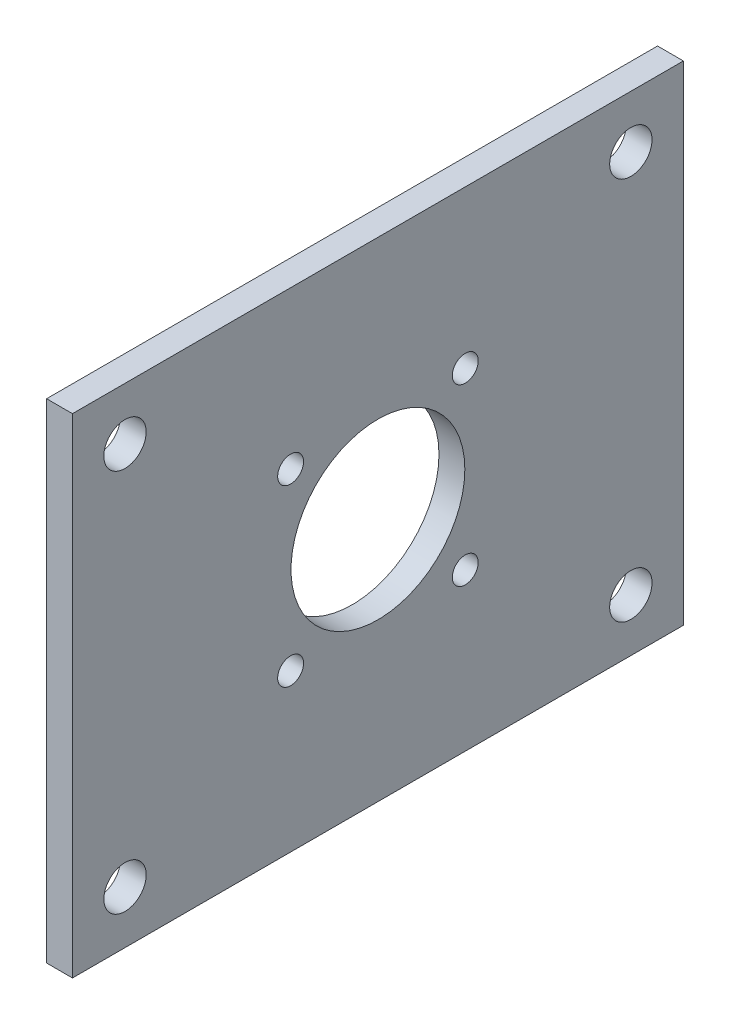
ISO-10303-21;
HEADER;
FILE_DESCRIPTION(('STEP AP214'),'2;1');
FILE_NAME('part.step','',(''),(''),'','','');
FILE_SCHEMA(('AUTOMOTIVE_DESIGN { 1 0 10303 214 1 1 1 1 }'));
ENDSEC;
DATA;
#1=APPLICATION_CONTEXT('core data for automotive mechanical design processes');
#2=APPLICATION_PROTOCOL_DEFINITION('international standard','automotive_design',2000,#1);
#3=PRODUCT_CONTEXT('',#1,'mechanical');
#4=PRODUCT('Part','Part','',(#3));
#5=PRODUCT_RELATED_PRODUCT_CATEGORY('part','',(#4));
#6=PRODUCT_DEFINITION_FORMATION('','',#4);
#7=PRODUCT_DEFINITION_CONTEXT('part definition',#1,'design');
#8=PRODUCT_DEFINITION('design','',#6,#7);
#9=PRODUCT_DEFINITION_SHAPE('','',#8);
#10=(LENGTH_UNIT() NAMED_UNIT(*) SI_UNIT(.MILLI.,.METRE.));
#11=(NAMED_UNIT(*) PLANE_ANGLE_UNIT() SI_UNIT($,.RADIAN.));
#12=(NAMED_UNIT(*) SI_UNIT($,.STERADIAN.) SOLID_ANGLE_UNIT());
#13=UNCERTAINTY_MEASURE_WITH_UNIT(LENGTH_MEASURE(1.E-05),#10,'distance_accuracy_value','');
#14=(GEOMETRIC_REPRESENTATION_CONTEXT(3) GLOBAL_UNCERTAINTY_ASSIGNED_CONTEXT((#13)) GLOBAL_UNIT_ASSIGNED_CONTEXT((#10,
#11,#12)) REPRESENTATION_CONTEXT('',''));
#15=CARTESIAN_POINT('',(0.,0.,0.));
#16=DIRECTION('',(0.,0.,1.));
#17=DIRECTION('',(1.,0.,0.));
#18=AXIS2_PLACEMENT_3D('',#15,#16,#17);
#19=CARTESIAN_POINT('',(-1.5875,-30.,-37.5));
#20=DIRECTION('',(0.,0.,-1.));
#21=DIRECTION('',(-1.,0.,0.));
#22=AXIS2_PLACEMENT_3D('',#19,#20,#21);
#23=PLANE('',#22);
#24=DIRECTION('',(1.,0.,0.));
#25=VECTOR('',#24,1.);
#26=CARTESIAN_POINT('',(-1.5875,30.,-37.5));
#27=LINE('',#26,#25);
#28=CARTESIAN_POINT('',(-1.5875,30.,-37.5));
#29=VERTEX_POINT('',#28);
#30=CARTESIAN_POINT('',(1.5875,30.,-37.5));
#31=VERTEX_POINT('',#30);
#32=EDGE_CURVE('E38',#29,#31,#27,.T.);
#33=ORIENTED_EDGE('',*,*,#32,.T.);
#34=DIRECTION('',(0.,1.,0.));
#35=VECTOR('',#34,1.);
#36=CARTESIAN_POINT('',(1.5875,-30.,-37.5));
#37=LINE('',#36,#35);
#38=CARTESIAN_POINT('',(1.5875,-30.,-37.5));
#39=VERTEX_POINT('',#38);
#40=EDGE_CURVE('E75',#39,#31,#37,.T.);
#41=ORIENTED_EDGE('',*,*,#40,.F.);
#42=DIRECTION('',(1.,0.,0.));
#43=VECTOR('',#42,1.);
#44=CARTESIAN_POINT('',(-1.5875,-30.,-37.5));
#45=LINE('',#44,#43);
#46=CARTESIAN_POINT('',(-1.5875,-30.,-37.5));
#47=VERTEX_POINT('',#46);
#48=EDGE_CURVE('E11',#47,#39,#45,.T.);
#49=ORIENTED_EDGE('',*,*,#48,.F.);
#50=DIRECTION('',(0.,1.,0.));
#51=VECTOR('',#50,1.);
#52=CARTESIAN_POINT('',(-1.5875,-30.,-37.5));
#53=LINE('',#52,#51);
#54=EDGE_CURVE('E76',#47,#29,#53,.T.);
#55=ORIENTED_EDGE('',*,*,#54,.T.);
#56=EDGE_LOOP('',(#33,#41,#49,#55));
#57=FACE_BOUND('',#56,.T.);
#58=ADVANCED_FACE('F35',(#57),#23,.T.);
#59=CARTESIAN_POINT('',(-1.5875,-30.,37.5));
#60=DIRECTION('',(0.,-1.,0.));
#61=DIRECTION('',(0.,0.,-1.));
#62=AXIS2_PLACEMENT_3D('',#59,#60,#61);
#63=PLANE('',#62);
#64=ORIENTED_EDGE('',*,*,#48,.T.);
#65=DIRECTION('',(0.,0.,-1.));
#66=VECTOR('',#65,1.);
#67=CARTESIAN_POINT('',(1.5875,-30.,37.5));
#68=LINE('',#67,#66);
#69=CARTESIAN_POINT('',(1.5875,-30.,37.5));
#70=VERTEX_POINT('',#69);
#71=EDGE_CURVE('E92',#70,#39,#68,.T.);
#72=ORIENTED_EDGE('',*,*,#71,.F.);
#73=DIRECTION('',(1.,0.,0.));
#74=VECTOR('',#73,1.);
#75=CARTESIAN_POINT('',(-1.5875,-30.,37.5));
#76=LINE('',#75,#74);
#77=CARTESIAN_POINT('',(-1.5875,-30.,37.5));
#78=VERTEX_POINT('',#77);
#79=EDGE_CURVE('E43',#78,#70,#76,.T.);
#80=ORIENTED_EDGE('',*,*,#79,.F.);
#81=DIRECTION('',(0.,0.,-1.));
#82=VECTOR('',#81,1.);
#83=CARTESIAN_POINT('',(-1.5875,-30.,37.5));
#84=LINE('',#83,#82);
#85=EDGE_CURVE('E81',#78,#47,#84,.T.);
#86=ORIENTED_EDGE('',*,*,#85,.T.);
#87=EDGE_LOOP('',(#64,#72,#80,#86));
#88=FACE_BOUND('',#87,.T.);
#89=ADVANCED_FACE('F112',(#88),#63,.T.);
#90=CARTESIAN_POINT('',(-1.5875,-30.,37.5));
#91=DIRECTION('',(0.,0.,1.));
#92=DIRECTION('',(1.,0.,0.));
#93=AXIS2_PLACEMENT_3D('',#90,#91,#92);
#94=PLANE('',#93);
#95=ORIENTED_EDGE('',*,*,#79,.T.);
#96=DIRECTION('',(0.,-1.,0.));
#97=VECTOR('',#96,1.);
#98=CARTESIAN_POINT('',(1.5875,-30.,37.5));
#99=LINE('',#98,#97);
#100=CARTESIAN_POINT('',(1.5875,30.,37.5));
#101=VERTEX_POINT('',#100);
#102=EDGE_CURVE('E88',#101,#70,#99,.T.);
#103=ORIENTED_EDGE('',*,*,#102,.F.);
#104=DIRECTION('',(1.,0.,0.));
#105=VECTOR('',#104,1.);
#106=CARTESIAN_POINT('',(-1.5875,30.,37.5));
#107=LINE('',#106,#105);
#108=CARTESIAN_POINT('',(-1.5875,30.,37.5));
#109=VERTEX_POINT('',#108);
#110=EDGE_CURVE('E80',#109,#101,#107,.T.);
#111=ORIENTED_EDGE('',*,*,#110,.F.);
#112=DIRECTION('',(0.,-1.,0.));
#113=VECTOR('',#112,1.);
#114=CARTESIAN_POINT('',(-1.5875,-30.,37.5));
#115=LINE('',#114,#113);
#116=EDGE_CURVE('E105',#109,#78,#115,.T.);
#117=ORIENTED_EDGE('',*,*,#116,.T.);
#118=EDGE_LOOP('',(#95,#103,#111,#117));
#119=FACE_BOUND('',#118,.T.);
#120=ADVANCED_FACE('F109',(#119),#94,.T.);
#121=CARTESIAN_POINT('',(-1.5875,30.,37.5));
#122=DIRECTION('',(0.,1.,0.));
#123=DIRECTION('',(0.,0.,1.));
#124=AXIS2_PLACEMENT_3D('',#121,#122,#123);
#125=PLANE('',#124);
#126=ORIENTED_EDGE('',*,*,#110,.T.);
#127=DIRECTION('',(0.,0.,1.));
#128=VECTOR('',#127,1.);
#129=CARTESIAN_POINT('',(1.5875,30.,37.5));
#130=LINE('',#129,#128);
#131=EDGE_CURVE('E83',#31,#101,#130,.T.);
#132=ORIENTED_EDGE('',*,*,#131,.F.);
#133=ORIENTED_EDGE('',*,*,#32,.F.);
#134=DIRECTION('',(0.,0.,1.));
#135=VECTOR('',#134,1.);
#136=CARTESIAN_POINT('',(-1.5875,30.,37.5));
#137=LINE('',#136,#135);
#138=EDGE_CURVE('E103',#29,#109,#137,.T.);
#139=ORIENTED_EDGE('',*,*,#138,.T.);
#140=EDGE_LOOP('',(#126,#132,#133,#139));
#141=FACE_BOUND('',#140,.T.);
#142=ADVANCED_FACE('F84',(#141),#125,.T.);
#143=CARTESIAN_POINT('',(-1.5875,0.,0.));
#144=DIRECTION('',(-1.,0.,0.));
#145=DIRECTION('',(0.,0.,1.));
#146=AXIS2_PLACEMENT_3D('',#143,#144,#145);
#147=PLANE('',#146);
#148=CARTESIAN_POINT('',(-1.5875,-10.72,10.72));
#149=DIRECTION('',(1.,0.,0.));
#150=DIRECTION('',(0.,0.,1.));
#151=AXIS2_PLACEMENT_3D('',#148,#149,#150);
#152=CIRCLE('',#151,1.59);
#153=CARTESIAN_POINT('',(-1.5875,-10.72,12.31));
#154=VERTEX_POINT('',#153);
#155=EDGE_CURVE('E245',#154,#154,#152,.T.);
#156=ORIENTED_EDGE('',*,*,#155,.T.);
#157=EDGE_LOOP('',(#156));
#158=FACE_BOUND('',#157,.T.);
#159=CARTESIAN_POINT('',(-1.5875,-10.72,-10.72));
#160=DIRECTION('',(1.,0.,0.));
#161=DIRECTION('',(0.,0.,-1.));
#162=AXIS2_PLACEMENT_3D('',#159,#160,#161);
#163=CIRCLE('',#162,1.59);
#164=CARTESIAN_POINT('',(-1.5875,-10.72,-12.31));
#165=VERTEX_POINT('',#164);
#166=EDGE_CURVE('E253',#165,#165,#163,.T.);
#167=ORIENTED_EDGE('',*,*,#166,.T.);
#168=EDGE_LOOP('',(#167));
#169=FACE_BOUND('',#168,.T.);
#170=CARTESIAN_POINT('',(-1.5875,10.72,-10.72));
#171=DIRECTION('',(1.,0.,0.));
#172=DIRECTION('',(0.,0.,1.));
#173=AXIS2_PLACEMENT_3D('',#170,#171,#172);
#174=CIRCLE('',#173,1.59);
#175=CARTESIAN_POINT('',(-1.5875,10.72,-9.13));
#176=VERTEX_POINT('',#175);
#177=EDGE_CURVE('E312',#176,#176,#174,.T.);
#178=ORIENTED_EDGE('',*,*,#177,.T.);
#179=EDGE_LOOP('',(#178));
#180=FACE_BOUND('',#179,.T.);
#181=CARTESIAN_POINT('',(-1.5875,10.72,10.72));
#182=DIRECTION('',(1.,0.,0.));
#183=DIRECTION('',(0.,0.,-1.));
#184=AXIS2_PLACEMENT_3D('',#181,#182,#183);
#185=CIRCLE('',#184,1.59);
#186=CARTESIAN_POINT('',(-1.5875,10.72,9.13));
#187=VERTEX_POINT('',#186);
#188=EDGE_CURVE('E260',#187,#187,#185,.T.);
#189=ORIENTED_EDGE('',*,*,#188,.T.);
#190=EDGE_LOOP('',(#189));
#191=FACE_BOUND('',#190,.T.);
#192=CARTESIAN_POINT('',(-1.5875,0.,0.));
#193=DIRECTION('',(1.,0.,0.));
#194=DIRECTION('',(0.,0.,-1.));
#195=AXIS2_PLACEMENT_3D('',#192,#193,#194);
#196=CIRCLE('',#195,10.67);
#197=CARTESIAN_POINT('',(-1.5875,0.,-10.67));
#198=VERTEX_POINT('',#197);
#199=EDGE_CURVE('E259',#198,#198,#196,.T.);
#200=ORIENTED_EDGE('',*,*,#199,.T.);
#201=EDGE_LOOP('',(#200));
#202=FACE_BOUND('',#201,.T.);
#203=CARTESIAN_POINT('',(-1.5875,-23.55,31.05));
#204=DIRECTION('',(1.,0.,0.));
#205=DIRECTION('',(0.,0.,1.));
#206=AXIS2_PLACEMENT_3D('',#203,#204,#205);
#207=CIRCLE('',#206,2.6);
#208=CARTESIAN_POINT('',(-1.5875,-23.55,33.65));
#209=VERTEX_POINT('',#208);
#210=EDGE_CURVE('E274',#209,#209,#207,.T.);
#211=ORIENTED_EDGE('',*,*,#210,.T.);
#212=EDGE_LOOP('',(#211));
#213=FACE_BOUND('',#212,.T.);
#214=CARTESIAN_POINT('',(-1.5875,-23.55,-31.05));
#215=DIRECTION('',(1.,0.,0.));
#216=DIRECTION('',(0.,0.,-1.));
#217=AXIS2_PLACEMENT_3D('',#214,#215,#216);
#218=CIRCLE('',#217,2.6);
#219=CARTESIAN_POINT('',(-1.5875,-23.55,-33.65));
#220=VERTEX_POINT('',#219);
#221=EDGE_CURVE('E268',#220,#220,#218,.T.);
#222=ORIENTED_EDGE('',*,*,#221,.T.);
#223=EDGE_LOOP('',(#222));
#224=FACE_BOUND('',#223,.T.);
#225=CARTESIAN_POINT('',(-1.5875,23.55,-31.05));
#226=DIRECTION('',(1.,0.,0.));
#227=DIRECTION('',(0.,0.,1.));
#228=AXIS2_PLACEMENT_3D('',#225,#226,#227);
#229=CIRCLE('',#228,2.6);
#230=CARTESIAN_POINT('',(-1.5875,23.55,-28.45));
#231=VERTEX_POINT('',#230);
#232=EDGE_CURVE('E267',#231,#231,#229,.T.);
#233=ORIENTED_EDGE('',*,*,#232,.T.);
#234=EDGE_LOOP('',(#233));
#235=FACE_BOUND('',#234,.T.);
#236=CARTESIAN_POINT('',(-1.5875,23.55,31.05));
#237=DIRECTION('',(1.,0.,0.));
#238=DIRECTION('',(0.,0.,-1.));
#239=AXIS2_PLACEMENT_3D('',#236,#237,#238);
#240=CIRCLE('',#239,2.6);
#241=CARTESIAN_POINT('',(-1.5875,23.55,28.45));
#242=VERTEX_POINT('',#241);
#243=EDGE_CURVE('E93',#242,#242,#240,.T.);
#244=ORIENTED_EDGE('',*,*,#243,.T.);
#245=EDGE_LOOP('',(#244));
#246=FACE_BOUND('',#245,.T.);
#247=ORIENTED_EDGE('',*,*,#54,.F.);
#248=ORIENTED_EDGE('',*,*,#85,.F.);
#249=ORIENTED_EDGE('',*,*,#116,.F.);
#250=ORIENTED_EDGE('',*,*,#138,.F.);
#251=EDGE_LOOP('',(#247,#248,#249,#250));
#252=FACE_BOUND('',#251,.T.);
#253=ADVANCED_FACE('F114',(#158,#169,#180,#191,#202,#213,#224,#235,#246,#252),#147,.T.);
#254=CARTESIAN_POINT('',(1.5875,0.,0.));
#255=DIRECTION('',(-1.,0.,0.));
#256=DIRECTION('',(0.,0.,1.));
#257=AXIS2_PLACEMENT_3D('',#254,#255,#256);
#258=PLANE('',#257);
#259=CARTESIAN_POINT('',(1.5875,-10.72,10.72));
#260=DIRECTION('',(1.,0.,0.));
#261=DIRECTION('',(0.,0.,1.));
#262=AXIS2_PLACEMENT_3D('',#259,#260,#261);
#263=CIRCLE('',#262,1.59);
#264=CARTESIAN_POINT('',(1.5875,-10.72,12.31));
#265=VERTEX_POINT('',#264);
#266=EDGE_CURVE('E248',#265,#265,#263,.T.);
#267=ORIENTED_EDGE('',*,*,#266,.F.);
#268=EDGE_LOOP('',(#267));
#269=FACE_BOUND('',#268,.T.);
#270=CARTESIAN_POINT('',(1.5875,-10.72,-10.72));
#271=DIRECTION('',(1.,0.,0.));
#272=DIRECTION('',(0.,0.,-1.));
#273=AXIS2_PLACEMENT_3D('',#270,#271,#272);
#274=CIRCLE('',#273,1.59);
#275=CARTESIAN_POINT('',(1.5875,-10.72,-12.31));
#276=VERTEX_POINT('',#275);
#277=EDGE_CURVE('E250',#276,#276,#274,.T.);
#278=ORIENTED_EDGE('',*,*,#277,.F.);
#279=EDGE_LOOP('',(#278));
#280=FACE_BOUND('',#279,.T.);
#281=CARTESIAN_POINT('',(1.5875,10.72,-10.72));
#282=DIRECTION('',(1.,0.,0.));
#283=DIRECTION('',(0.,0.,1.));
#284=AXIS2_PLACEMENT_3D('',#281,#282,#283);
#285=CIRCLE('',#284,1.59);
#286=CARTESIAN_POINT('',(1.5875,10.72,-9.13));
#287=VERTEX_POINT('',#286);
#288=EDGE_CURVE('E315',#287,#287,#285,.T.);
#289=ORIENTED_EDGE('',*,*,#288,.F.);
#290=EDGE_LOOP('',(#289));
#291=FACE_BOUND('',#290,.T.);
#292=CARTESIAN_POINT('',(1.5875,10.72,10.72));
#293=DIRECTION('',(1.,0.,0.));
#294=DIRECTION('',(0.,0.,-1.));
#295=AXIS2_PLACEMENT_3D('',#292,#293,#294);
#296=CIRCLE('',#295,1.59);
#297=CARTESIAN_POINT('',(1.5875,10.72,9.13));
#298=VERTEX_POINT('',#297);
#299=EDGE_CURVE('E307',#298,#298,#296,.T.);
#300=ORIENTED_EDGE('',*,*,#299,.F.);
#301=EDGE_LOOP('',(#300));
#302=FACE_BOUND('',#301,.T.);
#303=CARTESIAN_POINT('',(1.5875,0.,0.));
#304=DIRECTION('',(1.,0.,0.));
#305=DIRECTION('',(0.,0.,-1.));
#306=AXIS2_PLACEMENT_3D('',#303,#304,#305);
#307=CIRCLE('',#306,10.67);
#308=CARTESIAN_POINT('',(1.5875,0.,-10.67));
#309=VERTEX_POINT('',#308);
#310=EDGE_CURVE('E256',#309,#309,#307,.T.);
#311=ORIENTED_EDGE('',*,*,#310,.F.);
#312=EDGE_LOOP('',(#311));
#313=FACE_BOUND('',#312,.T.);
#314=CARTESIAN_POINT('',(1.5875,-23.55,31.05));
#315=DIRECTION('',(1.,0.,0.));
#316=DIRECTION('',(0.,0.,1.));
#317=AXIS2_PLACEMENT_3D('',#314,#315,#316);
#318=CIRCLE('',#317,2.6);
#319=CARTESIAN_POINT('',(1.5875,-23.55,33.65));
#320=VERTEX_POINT('',#319);
#321=EDGE_CURVE('E263',#320,#320,#318,.T.);
#322=ORIENTED_EDGE('',*,*,#321,.F.);
#323=EDGE_LOOP('',(#322));
#324=FACE_BOUND('',#323,.T.);
#325=CARTESIAN_POINT('',(1.5875,-23.55,-31.05));
#326=DIRECTION('',(1.,0.,0.));
#327=DIRECTION('',(0.,0.,-1.));
#328=AXIS2_PLACEMENT_3D('',#325,#326,#327);
#329=CIRCLE('',#328,2.6);
#330=CARTESIAN_POINT('',(1.5875,-23.55,-33.65));
#331=VERTEX_POINT('',#330);
#332=EDGE_CURVE('E271',#331,#331,#329,.T.);
#333=ORIENTED_EDGE('',*,*,#332,.F.);
#334=EDGE_LOOP('',(#333));
#335=FACE_BOUND('',#334,.T.);
#336=CARTESIAN_POINT('',(1.5875,23.55,-31.05));
#337=DIRECTION('',(1.,0.,0.));
#338=DIRECTION('',(0.,0.,1.));
#339=AXIS2_PLACEMENT_3D('',#336,#337,#338);
#340=CIRCLE('',#339,2.6);
#341=CARTESIAN_POINT('',(1.5875,23.55,-28.45));
#342=VERTEX_POINT('',#341);
#343=EDGE_CURVE('E264',#342,#342,#340,.T.);
#344=ORIENTED_EDGE('',*,*,#343,.F.);
#345=EDGE_LOOP('',(#344));
#346=FACE_BOUND('',#345,.T.);
#347=CARTESIAN_POINT('',(1.5875,23.55,31.05));
#348=DIRECTION('',(1.,0.,0.));
#349=DIRECTION('',(0.,0.,-1.));
#350=AXIS2_PLACEMENT_3D('',#347,#348,#349);
#351=CIRCLE('',#350,2.6);
#352=CARTESIAN_POINT('',(1.5875,23.55,28.45));
#353=VERTEX_POINT('',#352);
#354=EDGE_CURVE('E96',#353,#353,#351,.T.);
#355=ORIENTED_EDGE('',*,*,#354,.F.);
#356=EDGE_LOOP('',(#355));
#357=FACE_BOUND('',#356,.T.);
#358=ORIENTED_EDGE('',*,*,#40,.T.);
#359=ORIENTED_EDGE('',*,*,#131,.T.);
#360=ORIENTED_EDGE('',*,*,#102,.T.);
#361=ORIENTED_EDGE('',*,*,#71,.T.);
#362=EDGE_LOOP('',(#358,#359,#360,#361));
#363=FACE_BOUND('',#362,.T.);
#364=ADVANCED_FACE('F91',(#269,#280,#291,#302,#313,#324,#335,#346,#357,#363),#258,.F.);
#365=CARTESIAN_POINT('',(-1.5875,23.55,31.05));
#366=DIRECTION('',(1.,0.,0.));
#367=DIRECTION('',(0.,0.,-1.));
#368=AXIS2_PLACEMENT_3D('',#365,#366,#367);
#369=CYLINDRICAL_SURFACE('',#368,2.6);
#370=ORIENTED_EDGE('',*,*,#243,.F.);
#371=EDGE_LOOP('',(#370));
#372=FACE_BOUND('',#371,.T.);
#373=ORIENTED_EDGE('',*,*,#354,.T.);
#374=EDGE_LOOP('',(#373));
#375=FACE_BOUND('',#374,.T.);
#376=ADVANCED_FACE('F122',(#372,#375),#369,.F.);
#377=CARTESIAN_POINT('',(-1.5875,23.55,-31.05));
#378=DIRECTION('',(1.,0.,0.));
#379=DIRECTION('',(0.,0.,-1.));
#380=AXIS2_PLACEMENT_3D('',#377,#378,#379);
#381=CYLINDRICAL_SURFACE('',#380,2.6);
#382=ORIENTED_EDGE('',*,*,#232,.F.);
#383=EDGE_LOOP('',(#382));
#384=FACE_BOUND('',#383,.T.);
#385=ORIENTED_EDGE('',*,*,#343,.T.);
#386=EDGE_LOOP('',(#385));
#387=FACE_BOUND('',#386,.T.);
#388=ADVANCED_FACE('F161',(#384,#387),#381,.F.);
#389=CARTESIAN_POINT('',(-1.5875,-23.55,-31.05));
#390=DIRECTION('',(1.,0.,0.));
#391=DIRECTION('',(0.,0.,-1.));
#392=AXIS2_PLACEMENT_3D('',#389,#390,#391);
#393=CYLINDRICAL_SURFACE('',#392,2.6);
#394=ORIENTED_EDGE('',*,*,#221,.F.);
#395=EDGE_LOOP('',(#394));
#396=FACE_BOUND('',#395,.T.);
#397=ORIENTED_EDGE('',*,*,#332,.T.);
#398=EDGE_LOOP('',(#397));
#399=FACE_BOUND('',#398,.T.);
#400=ADVANCED_FACE('F168',(#396,#399),#393,.F.);
#401=CARTESIAN_POINT('',(-1.5875,-23.55,31.05));
#402=DIRECTION('',(1.,0.,0.));
#403=DIRECTION('',(0.,0.,-1.));
#404=AXIS2_PLACEMENT_3D('',#401,#402,#403);
#405=CYLINDRICAL_SURFACE('',#404,2.6);
#406=ORIENTED_EDGE('',*,*,#210,.F.);
#407=EDGE_LOOP('',(#406));
#408=FACE_BOUND('',#407,.T.);
#409=ORIENTED_EDGE('',*,*,#321,.T.);
#410=EDGE_LOOP('',(#409));
#411=FACE_BOUND('',#410,.T.);
#412=ADVANCED_FACE('F176',(#408,#411),#405,.F.);
#413=CARTESIAN_POINT('',(-1.5875,0.,0.));
#414=DIRECTION('',(1.,0.,0.));
#415=DIRECTION('',(0.,0.,-1.));
#416=AXIS2_PLACEMENT_3D('',#413,#414,#415);
#417=CYLINDRICAL_SURFACE('',#416,10.67);
#418=ORIENTED_EDGE('',*,*,#199,.F.);
#419=EDGE_LOOP('',(#418));
#420=FACE_BOUND('',#419,.T.);
#421=ORIENTED_EDGE('',*,*,#310,.T.);
#422=EDGE_LOOP('',(#421));
#423=FACE_BOUND('',#422,.T.);
#424=ADVANCED_FACE('F183',(#420,#423),#417,.F.);
#425=CARTESIAN_POINT('',(-1.5875,10.72,10.72));
#426=DIRECTION('',(1.,0.,0.));
#427=DIRECTION('',(0.,0.,-1.));
#428=AXIS2_PLACEMENT_3D('',#425,#426,#427);
#429=CYLINDRICAL_SURFACE('',#428,1.59);
#430=ORIENTED_EDGE('',*,*,#188,.F.);
#431=EDGE_LOOP('',(#430));
#432=FACE_BOUND('',#431,.T.);
#433=ORIENTED_EDGE('',*,*,#299,.T.);
#434=EDGE_LOOP('',(#433));
#435=FACE_BOUND('',#434,.T.);
#436=ADVANCED_FACE('F190',(#432,#435),#429,.F.);
#437=CARTESIAN_POINT('',(-1.5875,10.72,-10.72));
#438=DIRECTION('',(1.,0.,0.));
#439=DIRECTION('',(0.,0.,-1.));
#440=AXIS2_PLACEMENT_3D('',#437,#438,#439);
#441=CYLINDRICAL_SURFACE('',#440,1.59);
#442=ORIENTED_EDGE('',*,*,#177,.F.);
#443=EDGE_LOOP('',(#442));
#444=FACE_BOUND('',#443,.T.);
#445=ORIENTED_EDGE('',*,*,#288,.T.);
#446=EDGE_LOOP('',(#445));
#447=FACE_BOUND('',#446,.T.);
#448=ADVANCED_FACE('F198',(#444,#447),#441,.F.);
#449=CARTESIAN_POINT('',(-1.5875,-10.72,-10.72));
#450=DIRECTION('',(1.,0.,0.));
#451=DIRECTION('',(0.,0.,-1.));
#452=AXIS2_PLACEMENT_3D('',#449,#450,#451);
#453=CYLINDRICAL_SURFACE('',#452,1.59);
#454=ORIENTED_EDGE('',*,*,#166,.F.);
#455=EDGE_LOOP('',(#454));
#456=FACE_BOUND('',#455,.T.);
#457=ORIENTED_EDGE('',*,*,#277,.T.);
#458=EDGE_LOOP('',(#457));
#459=FACE_BOUND('',#458,.T.);
#460=ADVANCED_FACE('F206',(#456,#459),#453,.F.);
#461=CARTESIAN_POINT('',(-1.5875,-10.72,10.72));
#462=DIRECTION('',(1.,0.,0.));
#463=DIRECTION('',(0.,0.,-1.));
#464=AXIS2_PLACEMENT_3D('',#461,#462,#463);
#465=CYLINDRICAL_SURFACE('',#464,1.59);
#466=ORIENTED_EDGE('',*,*,#155,.F.);
#467=EDGE_LOOP('',(#466));
#468=FACE_BOUND('',#467,.T.);
#469=ORIENTED_EDGE('',*,*,#266,.T.);
#470=EDGE_LOOP('',(#469));
#471=FACE_BOUND('',#470,.T.);
#472=ADVANCED_FACE('F214',(#468,#471),#465,.F.);
#473=CLOSED_SHELL('',(#58,#89,#120,#142,#253,#364,#376,#388,#400,#412,#424,#436,#448,#460,#472));
#474=MANIFOLD_SOLID_BREP('B2',#473);
#475=ADVANCED_BREP_SHAPE_REPRESENTATION('',(#18,#474),#14);
#476=SHAPE_DEFINITION_REPRESENTATION(#9,#475);
ENDSEC;
END-ISO-10303-21;
